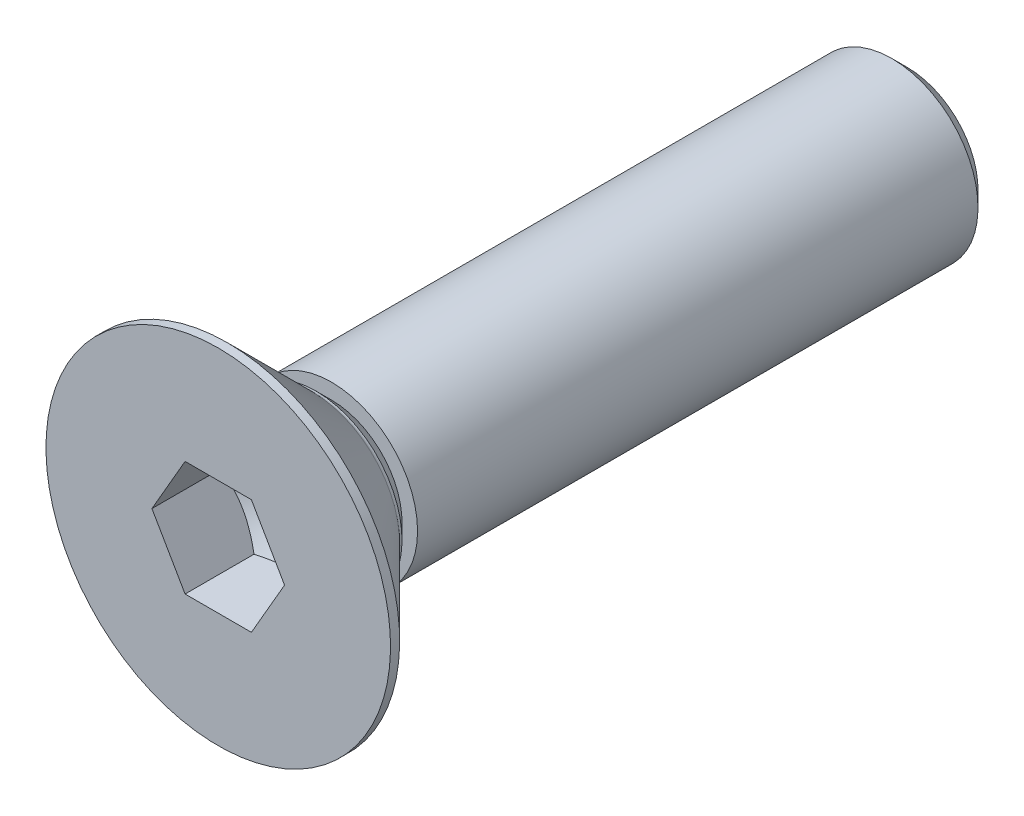
ISO-10303-21;
HEADER;
FILE_DESCRIPTION(('STEP AP214'),'2;1');
FILE_NAME('part.step','',(''),(''),'','','');
FILE_SCHEMA(('AUTOMOTIVE_DESIGN { 1 0 10303 214 1 1 1 1 }'));
ENDSEC;
DATA;
#1=APPLICATION_CONTEXT('core data for automotive mechanical design processes');
#2=APPLICATION_PROTOCOL_DEFINITION('international standard','automotive_design',2000,#1);
#3=PRODUCT_CONTEXT('',#1,'mechanical');
#4=PRODUCT('Part','Part','',(#3));
#5=PRODUCT_RELATED_PRODUCT_CATEGORY('part','',(#4));
#6=PRODUCT_DEFINITION_FORMATION('','',#4);
#7=PRODUCT_DEFINITION_CONTEXT('part definition',#1,'design');
#8=PRODUCT_DEFINITION('design','',#6,#7);
#9=PRODUCT_DEFINITION_SHAPE('','',#8);
#10=(LENGTH_UNIT() NAMED_UNIT(*) SI_UNIT(.MILLI.,.METRE.));
#11=(NAMED_UNIT(*) PLANE_ANGLE_UNIT() SI_UNIT($,.RADIAN.));
#12=(NAMED_UNIT(*) SI_UNIT($,.STERADIAN.) SOLID_ANGLE_UNIT());
#13=UNCERTAINTY_MEASURE_WITH_UNIT(LENGTH_MEASURE(1.E-05),#10,'distance_accuracy_value','');
#14=(GEOMETRIC_REPRESENTATION_CONTEXT(3) GLOBAL_UNCERTAINTY_ASSIGNED_CONTEXT((#13)) GLOBAL_UNIT_ASSIGNED_CONTEXT((#10,
#11,#12)) REPRESENTATION_CONTEXT('',''));
#15=CARTESIAN_POINT('',(0.,0.,0.));
#16=DIRECTION('',(0.,0.,1.));
#17=DIRECTION('',(1.,0.,0.));
#18=AXIS2_PLACEMENT_3D('',#15,#16,#17);
#19=CARTESIAN_POINT('',(0.,0.6146875,-12.));
#20=DIRECTION('',(0.,0.,-1.));
#21=DIRECTION('',(0.,1.,0.));
#22=AXIS2_PLACEMENT_3D('',#19,#20,#21);
#23=PLANE('',#22);
#24=CARTESIAN_POINT('',(0.,0.,-12.));
#25=DIRECTION('',(0.,0.,-1.));
#26=DIRECTION('',(0.,1.,0.));
#27=AXIS2_PLACEMENT_3D('',#24,#25,#26);
#28=CIRCLE('',#27,1.229375);
#29=CARTESIAN_POINT('',(0.,1.229375,-12.));
#30=VERTEX_POINT('',#29);
#31=EDGE_CURVE('E11',#30,#30,#28,.T.);
#32=ORIENTED_EDGE('',*,*,#31,.T.);
#33=EDGE_LOOP('',(#32));
#34=FACE_BOUND('',#33,.T.);
#35=ADVANCED_FACE('F16',(#34),#23,.T.);
#36=CARTESIAN_POINT('',(0.,0.,-11.8646875));
#37=DIRECTION('',(0.,0.,1.));
#38=DIRECTION('',(0.,1.,0.));
#39=AXIS2_PLACEMENT_3D('',#36,#37,#38);
#40=CONICAL_SURFACE('',#39,1.3646875,0.78539816339745);
#41=CARTESIAN_POINT('',(0.,0.,-11.729375));
#42=DIRECTION('',(0.,0.,-1.));
#43=DIRECTION('',(0.,1.,0.));
#44=AXIS2_PLACEMENT_3D('',#41,#42,#43);
#45=CIRCLE('',#44,1.5);
#46=CARTESIAN_POINT('',(0.,1.5,-11.729375));
#47=VERTEX_POINT('',#46);
#48=EDGE_CURVE('E25',#47,#47,#45,.T.);
#49=ORIENTED_EDGE('',*,*,#48,.T.);
#50=EDGE_LOOP('',(#49));
#51=FACE_BOUND('',#50,.T.);
#52=ORIENTED_EDGE('',*,*,#31,.F.);
#53=EDGE_LOOP('',(#52));
#54=FACE_BOUND('',#53,.T.);
#55=ADVANCED_FACE('F188',(#51,#54),#40,.T.);
#56=CARTESIAN_POINT('',(0.,0.,-6.7646875));
#57=DIRECTION('',(0.,0.,1.));
#58=DIRECTION('',(0.,1.,0.));
#59=AXIS2_PLACEMENT_3D('',#56,#57,#58);
#60=CYLINDRICAL_SURFACE('',#59,1.5);
#61=ORIENTED_EDGE('',*,*,#48,.F.);
#62=EDGE_LOOP('',(#61));
#63=FACE_BOUND('',#62,.T.);
#64=CARTESIAN_POINT('',(0.,0.,-1.970625));
#65=DIRECTION('',(0.,0.,-1.));
#66=DIRECTION('',(0.,1.,0.));
#67=AXIS2_PLACEMENT_3D('',#64,#65,#66);
#68=CIRCLE('',#67,1.5);
#69=CARTESIAN_POINT('',(0.,-1.5,-1.970625));
#70=VERTEX_POINT('',#69);
#71=EDGE_CURVE('E154',#70,#70,#68,.T.);
#72=ORIENTED_EDGE('',*,*,#71,.T.);
#73=EDGE_LOOP('',(#72));
#74=FACE_BOUND('',#73,.T.);
#75=ADVANCED_FACE('F179',(#63,#74),#60,.T.);
#76=CARTESIAN_POINT('',(0.,0.,-1.7));
#77=DIRECTION('',(0.,0.,-1.));
#78=DIRECTION('',(-1.,0.,0.));
#79=AXIS2_PLACEMENT_3D('',#76,#77,#78);
#80=TOROIDAL_SURFACE('',#79,1.6,0.1);
#81=CARTESIAN_POINT('',(0.,0.,-1.62928932188134));
#82=DIRECTION('',(0.,0.,-1.));
#83=DIRECTION('',(0.,1.,0.));
#84=AXIS2_PLACEMENT_3D('',#81,#82,#83);
#85=CIRCLE('',#84,1.52928932188135);
#86=CARTESIAN_POINT('',(0.,1.52928932188135,-1.62928932188134));
#87=VERTEX_POINT('',#86);
#88=EDGE_CURVE('E19',#87,#87,#85,.T.);
#89=ORIENTED_EDGE('',*,*,#88,.T.);
#90=EDGE_LOOP('',(#89));
#91=FACE_BOUND('',#90,.T.);
#92=CARTESIAN_POINT('',(0.,0.,-1.7));
#93=DIRECTION('',(0.,0.,-1.));
#94=DIRECTION('',(0.,1.,0.));
#95=AXIS2_PLACEMENT_3D('',#92,#93,#94);
#96=CIRCLE('',#95,1.5);
#97=CARTESIAN_POINT('',(0.,1.5,-1.7));
#98=VERTEX_POINT('',#97);
#99=EDGE_CURVE('E153',#98,#98,#96,.T.);
#100=ORIENTED_EDGE('',*,*,#99,.F.);
#101=EDGE_LOOP('',(#100));
#102=FACE_BOUND('',#101,.T.);
#103=ADVANCED_FACE('F94',(#91,#102),#80,.F.);
#104=CARTESIAN_POINT('',(0.,0.,-0.893933982822018));
#105=DIRECTION('',(0.,0.,1.));
#106=DIRECTION('',(0.,1.,0.));
#107=AXIS2_PLACEMENT_3D('',#104,#105,#106);
#108=CONICAL_SURFACE('',#107,2.26464466094068,0.785398163397448);
#109=CARTESIAN_POINT('',(0.,0.,-0.158578643762691));
#110=DIRECTION('',(0.,0.,-1.));
#111=DIRECTION('',(0.,1.,0.));
#112=AXIS2_PLACEMENT_3D('',#109,#110,#111);
#113=CIRCLE('',#112,3.);
#114=CARTESIAN_POINT('',(0.,3.,-0.15857864376269));
#115=VERTEX_POINT('',#114);
#116=EDGE_CURVE('E97',#115,#115,#113,.T.);
#117=ORIENTED_EDGE('',*,*,#116,.T.);
#118=EDGE_LOOP('',(#117));
#119=FACE_BOUND('',#118,.T.);
#120=ORIENTED_EDGE('',*,*,#88,.F.);
#121=EDGE_LOOP('',(#120));
#122=FACE_BOUND('',#121,.T.);
#123=ADVANCED_FACE('F178',(#119,#122),#108,.T.);
#124=CARTESIAN_POINT('',(0.,0.,-0.0792893218813458));
#125=DIRECTION('',(0.,0.,1.));
#126=DIRECTION('',(0.,1.,0.));
#127=AXIS2_PLACEMENT_3D('',#124,#125,#126);
#128=CYLINDRICAL_SURFACE('',#127,3.);
#129=CARTESIAN_POINT('',(0.,0.,0.));
#130=DIRECTION('',(0.,0.,-1.));
#131=DIRECTION('',(0.,1.,0.));
#132=AXIS2_PLACEMENT_3D('',#129,#130,#131);
#133=CIRCLE('',#132,3.);
#134=CARTESIAN_POINT('',(0.,3.,0.));
#135=VERTEX_POINT('',#134);
#136=EDGE_CURVE('E99',#135,#135,#133,.T.);
#137=ORIENTED_EDGE('',*,*,#136,.T.);
#138=EDGE_LOOP('',(#137));
#139=FACE_BOUND('',#138,.T.);
#140=ORIENTED_EDGE('',*,*,#116,.F.);
#141=EDGE_LOOP('',(#140));
#142=FACE_BOUND('',#141,.T.);
#143=ADVANCED_FACE('F186',(#139,#142),#128,.T.);
#144=CARTESIAN_POINT('',(0.,1.5,0.));
#145=DIRECTION('',(0.,0.,1.));
#146=DIRECTION('',(0.,-1.,0.));
#147=AXIS2_PLACEMENT_3D('',#144,#145,#146);
#148=PLANE('',#147);
#149=ORIENTED_EDGE('',*,*,#136,.F.);
#150=EDGE_LOOP('',(#149));
#151=FACE_BOUND('',#150,.T.);
#152=DIRECTION('',(-0.5,0.866025403784439,0.));
#153=VECTOR('',#152,1.);
#154=CARTESIAN_POINT('',(-1.19078452641916,0.062500233125054,0.));
#155=LINE('',#154,#153);
#156=CARTESIAN_POINT('',(-0.57735,-0.999999533749891,0.));
#157=VERTEX_POINT('',#156);
#158=CARTESIAN_POINT('',(-1.1547,0.,0.));
#159=VERTEX_POINT('',#158);
#160=EDGE_CURVE('E108',#157,#159,#155,.T.);
#161=ORIENTED_EDGE('',*,*,#160,.T.);
#162=DIRECTION('',(0.5,0.866025403784439,0.));
#163=VECTOR('',#162,1.);
#164=CARTESIAN_POINT('',(-0.541265473580836,1.06249976687495,0.));
#165=LINE('',#164,#163);
#166=CARTESIAN_POINT('',(-0.57735,0.999999533749891,0.));
#167=VERTEX_POINT('',#166);
#168=EDGE_CURVE('E104',#159,#167,#165,.T.);
#169=ORIENTED_EDGE('',*,*,#168,.T.);
#170=DIRECTION('',(1.,0.,0.));
#171=VECTOR('',#170,1.);
#172=CARTESIAN_POINT('',(0.,0.999999533749891,0.));
#173=LINE('',#172,#171);
#174=CARTESIAN_POINT('',(0.57735,0.999999533749891,0.));
#175=VERTEX_POINT('',#174);
#176=EDGE_CURVE('E163',#167,#175,#173,.T.);
#177=ORIENTED_EDGE('',*,*,#176,.T.);
#178=DIRECTION('',(0.5,-0.866025403784439,0.));
#179=VECTOR('',#178,1.);
#180=CARTESIAN_POINT('',(0.541265473580836,1.06249976687495,0.));
#181=LINE('',#180,#179);
#182=CARTESIAN_POINT('',(1.1547,0.,0.));
#183=VERTEX_POINT('',#182);
#184=EDGE_CURVE('E158',#175,#183,#181,.T.);
#185=ORIENTED_EDGE('',*,*,#184,.T.);
#186=DIRECTION('',(-0.5,-0.866025403784439,0.));
#187=VECTOR('',#186,1.);
#188=CARTESIAN_POINT('',(1.19078452641916,0.0625002331250542,0.));
#189=LINE('',#188,#187);
#190=CARTESIAN_POINT('',(0.57735,-0.999999533749891,0.));
#191=VERTEX_POINT('',#190);
#192=EDGE_CURVE('E116',#183,#191,#189,.T.);
#193=ORIENTED_EDGE('',*,*,#192,.T.);
#194=DIRECTION('',(-1.,0.,0.));
#195=VECTOR('',#194,1.);
#196=CARTESIAN_POINT('',(0.,-0.999999533749891,0.));
#197=LINE('',#196,#195);
#198=EDGE_CURVE('E75',#191,#157,#197,.T.);
#199=ORIENTED_EDGE('',*,*,#198,.T.);
#200=EDGE_LOOP('',(#161,#169,#177,#185,#193,#199));
#201=FACE_BOUND('',#200,.T.);
#202=ADVANCED_FACE('F208',(#151,#201),#148,.T.);
#203=CARTESIAN_POINT('',(-0.866025,0.499999766874945,1.));
#204=DIRECTION('',(-0.866025403784439,0.5,0.));
#205=DIRECTION('',(0.5,0.866025403784439,0.));
#206=AXIS2_PLACEMENT_3D('',#203,#204,#205);
#207=PLANE('',#206);
#208=ORIENTED_EDGE('',*,*,#168,.F.);
#209=DIRECTION('',(0.,0.,-1.));
#210=VECTOR('',#209,1.);
#211=CARTESIAN_POINT('',(-1.1547,0.,1.));
#212=LINE('',#211,#210);
#213=CARTESIAN_POINT('',(-1.1547,0.,-1.2));
#214=VERTEX_POINT('',#213);
#215=EDGE_CURVE('E111',#159,#214,#212,.T.);
#216=ORIENTED_EDGE('',*,*,#215,.T.);
#217=CARTESIAN_POINT('',(-1.1547,0.,-1.2));
#218=CARTESIAN_POINT('',(-0.866025000000001,0.499999766874945,-1.36666658895832));
#219=CARTESIAN_POINT('',(-0.57735,0.999999533749891,-1.2));
#220=(BOUNDED_CURVE() B_SPLINE_CURVE(2,(#217,#218,#219),.UNSPECIFIED.,.F.,
.F.) B_SPLINE_CURVE_WITH_KNOTS((3,3),(0.,1.16843559329444),
.UNSPECIFIED.) CURVE() GEOMETRIC_REPRESENTATION_ITEM() RATIONAL_B_SPLINE_CURVE((1.,
1.15470053837925,1.)) REPRESENTATION_ITEM(''));
#221=CARTESIAN_POINT('',(-0.57735,0.999999533749891,-1.2));
#222=VERTEX_POINT('',#221);
#223=EDGE_CURVE('E123',#214,#222,#220,.T.);
#224=ORIENTED_EDGE('',*,*,#223,.T.);
#225=DIRECTION('',(0.,0.,-1.));
#226=VECTOR('',#225,1.);
#227=CARTESIAN_POINT('',(-0.57735,0.999999533749891,1.));
#228=LINE('',#227,#226);
#229=EDGE_CURVE('E165',#167,#222,#228,.T.);
#230=ORIENTED_EDGE('',*,*,#229,.F.);
#231=EDGE_LOOP('',(#208,#216,#224,#230));
#232=FACE_BOUND('',#231,.T.);
#233=ADVANCED_FACE('F210',(#232),#207,.F.);
#234=CARTESIAN_POINT('',(0.,0.999999533749891,1.));
#235=DIRECTION('',(0.,1.,0.));
#236=DIRECTION('',(1.,0.,0.));
#237=AXIS2_PLACEMENT_3D('',#234,#235,#236);
#238=PLANE('',#237);
#239=ORIENTED_EDGE('',*,*,#176,.F.);
#240=ORIENTED_EDGE('',*,*,#229,.T.);
#241=CARTESIAN_POINT('',(-0.57735,0.999999533749891,-1.2));
#242=CARTESIAN_POINT('',(0.,0.999999533749893,-1.36666658895832));
#243=CARTESIAN_POINT('',(0.57735,0.999999533749891,-1.2));
#244=(BOUNDED_CURVE() B_SPLINE_CURVE(2,(#241,#242,#243),.UNSPECIFIED.,.F.,
.F.) B_SPLINE_CURVE_WITH_KNOTS((3,3),(0.,1.16843559329444),
.UNSPECIFIED.) CURVE() GEOMETRIC_REPRESENTATION_ITEM() RATIONAL_B_SPLINE_CURVE((1.,
1.15470053837925,1.)) REPRESENTATION_ITEM(''));
#245=CARTESIAN_POINT('',(0.57735,0.999999533749891,-1.2));
#246=VERTEX_POINT('',#245);
#247=EDGE_CURVE('E120',#222,#246,#244,.T.);
#248=ORIENTED_EDGE('',*,*,#247,.T.);
#249=DIRECTION('',(0.,0.,-1.));
#250=VECTOR('',#249,1.);
#251=CARTESIAN_POINT('',(0.57735,0.999999533749891,1.));
#252=LINE('',#251,#250);
#253=EDGE_CURVE('E155',#175,#246,#252,.T.);
#254=ORIENTED_EDGE('',*,*,#253,.F.);
#255=EDGE_LOOP('',(#239,#240,#248,#254));
#256=FACE_BOUND('',#255,.T.);
#257=ADVANCED_FACE('F216',(#256),#238,.F.);
#258=CARTESIAN_POINT('',(-0.866025,-0.499999766874946,1.));
#259=DIRECTION('',(-0.866025403784439,-0.5,0.));
#260=DIRECTION('',(-0.5,0.866025403784439,0.));
#261=AXIS2_PLACEMENT_3D('',#258,#259,#260);
#262=PLANE('',#261);
#263=ORIENTED_EDGE('',*,*,#160,.F.);
#264=DIRECTION('',(0.,0.,-1.));
#265=VECTOR('',#264,1.);
#266=CARTESIAN_POINT('',(-0.57735,-0.999999533749891,1.));
#267=LINE('',#266,#265);
#268=CARTESIAN_POINT('',(-0.57735,-0.999999533749892,-1.2));
#269=VERTEX_POINT('',#268);
#270=EDGE_CURVE('E118',#157,#269,#267,.T.);
#271=ORIENTED_EDGE('',*,*,#270,.T.);
#272=CARTESIAN_POINT('',(-0.57735,-0.999999533749891,-1.2));
#273=CARTESIAN_POINT('',(-0.866025,-0.499999766874945,-1.36666658895832));
#274=CARTESIAN_POINT('',(-1.1547,0.,-1.2));
#275=(BOUNDED_CURVE() B_SPLINE_CURVE(2,(#272,#273,#274),.UNSPECIFIED.,.F.,
.F.) B_SPLINE_CURVE_WITH_KNOTS((3,3),(0.,1.16843559329444),
.UNSPECIFIED.) CURVE() GEOMETRIC_REPRESENTATION_ITEM() RATIONAL_B_SPLINE_CURVE((1.,
1.15470053837925,1.)) REPRESENTATION_ITEM(''));
#276=EDGE_CURVE('E112',#269,#214,#275,.T.);
#277=ORIENTED_EDGE('',*,*,#276,.T.);
#278=ORIENTED_EDGE('',*,*,#215,.F.);
#279=EDGE_LOOP('',(#263,#271,#277,#278));
#280=FACE_BOUND('',#279,.T.);
#281=ADVANCED_FACE('F226',(#280),#262,.F.);
#282=CARTESIAN_POINT('',(0.,0.,-1.53333317791663));
#283=DIRECTION('',(0.,0.,1.));
#284=DIRECTION('',(0.,1.,0.));
#285=AXIS2_PLACEMENT_3D('',#282,#283,#284);
#286=CONICAL_SURFACE('',#285,0.57735,1.0471975511966);
#287=CARTESIAN_POINT('',(0.,0.,-1.86666635583326));
#288=VERTEX_POINT('',#287);
#289=VERTEX_LOOP('',#288);
#290=FACE_BOUND('',#289,.T.);
#291=CARTESIAN_POINT('',(0.57735,0.999999533749891,-1.2));
#292=CARTESIAN_POINT('',(0.866025000000001,0.499999766874945,-1.36666658895832));
#293=CARTESIAN_POINT('',(1.1547,0.,-1.2));
#294=(BOUNDED_CURVE() B_SPLINE_CURVE(2,(#291,#292,#293),.UNSPECIFIED.,.F.,
.F.) B_SPLINE_CURVE_WITH_KNOTS((3,3),(0.,1.16843559329444),
.UNSPECIFIED.) CURVE() GEOMETRIC_REPRESENTATION_ITEM() RATIONAL_B_SPLINE_CURVE((1.,
1.15470053837925,1.)) REPRESENTATION_ITEM(''));
#295=CARTESIAN_POINT('',(1.1547,0.,-1.2));
#296=VERTEX_POINT('',#295);
#297=EDGE_CURVE('E117',#246,#296,#294,.T.);
#298=ORIENTED_EDGE('',*,*,#297,.F.);
#299=ORIENTED_EDGE('',*,*,#247,.F.);
#300=ORIENTED_EDGE('',*,*,#223,.F.);
#301=ORIENTED_EDGE('',*,*,#276,.F.);
#302=CARTESIAN_POINT('',(0.57735,-0.999999533749891,-1.2));
#303=CARTESIAN_POINT('',(0.,-0.999999533749893,-1.36666658895832));
#304=CARTESIAN_POINT('',(-0.57735,-0.999999533749891,-1.2));
#305=(BOUNDED_CURVE() B_SPLINE_CURVE(2,(#302,#303,#304),.UNSPECIFIED.,.F.,
.F.) B_SPLINE_CURVE_WITH_KNOTS((3,3),(0.,1.16843559329444),
.UNSPECIFIED.) CURVE() GEOMETRIC_REPRESENTATION_ITEM() RATIONAL_B_SPLINE_CURVE((1.,
1.15470053837925,1.)) REPRESENTATION_ITEM(''));
#306=CARTESIAN_POINT('',(0.57735,-0.999999533749891,-1.2));
#307=VERTEX_POINT('',#306);
#308=EDGE_CURVE('E67',#307,#269,#305,.T.);
#309=ORIENTED_EDGE('',*,*,#308,.F.);
#310=CARTESIAN_POINT('',(1.1547,0.,-1.2));
#311=CARTESIAN_POINT('',(0.866025000000001,-0.499999766874945,-1.36666658895832));
#312=CARTESIAN_POINT('',(0.57735,-0.999999533749891,-1.2));
#313=(BOUNDED_CURVE() B_SPLINE_CURVE(2,(#310,#311,#312),.UNSPECIFIED.,.F.,
.F.) B_SPLINE_CURVE_WITH_KNOTS((3,3),(0.,1.16843559329444),
.UNSPECIFIED.) CURVE() GEOMETRIC_REPRESENTATION_ITEM() RATIONAL_B_SPLINE_CURVE((1.,
1.15470053837925,1.)) REPRESENTATION_ITEM(''));
#314=EDGE_CURVE('E135',#296,#307,#313,.T.);
#315=ORIENTED_EDGE('',*,*,#314,.F.);
#316=EDGE_LOOP('',(#298,#299,#300,#301,#309,#315));
#317=FACE_BOUND('',#316,.T.);
#318=ADVANCED_FACE('F228',(#290,#317),#286,.F.);
#319=CARTESIAN_POINT('',(0.,-0.999999533749891,1.));
#320=DIRECTION('',(0.,-1.,0.));
#321=DIRECTION('',(-1.,0.,0.));
#322=AXIS2_PLACEMENT_3D('',#319,#320,#321);
#323=PLANE('',#322);
#324=ORIENTED_EDGE('',*,*,#198,.F.);
#325=DIRECTION('',(0.,0.,-1.));
#326=VECTOR('',#325,1.);
#327=CARTESIAN_POINT('',(0.57735,-0.999999533749891,1.));
#328=LINE('',#327,#326);
#329=EDGE_CURVE('E126',#191,#307,#328,.T.);
#330=ORIENTED_EDGE('',*,*,#329,.T.);
#331=ORIENTED_EDGE('',*,*,#308,.T.);
#332=ORIENTED_EDGE('',*,*,#270,.F.);
#333=EDGE_LOOP('',(#324,#330,#331,#332));
#334=FACE_BOUND('',#333,.T.);
#335=ADVANCED_FACE('F206',(#334),#323,.F.);
#336=CARTESIAN_POINT('',(0.866025,-0.499999766874946,1.));
#337=DIRECTION('',(0.866025403784439,-0.5,0.));
#338=DIRECTION('',(-0.5,-0.866025403784439,0.));
#339=AXIS2_PLACEMENT_3D('',#336,#337,#338);
#340=PLANE('',#339);
#341=ORIENTED_EDGE('',*,*,#192,.F.);
#342=DIRECTION('',(0.,0.,-1.));
#343=VECTOR('',#342,1.);
#344=CARTESIAN_POINT('',(1.1547,0.,1.));
#345=LINE('',#344,#343);
#346=EDGE_CURVE('E113',#183,#296,#345,.T.);
#347=ORIENTED_EDGE('',*,*,#346,.T.);
#348=ORIENTED_EDGE('',*,*,#314,.T.);
#349=ORIENTED_EDGE('',*,*,#329,.F.);
#350=EDGE_LOOP('',(#341,#347,#348,#349));
#351=FACE_BOUND('',#350,.T.);
#352=ADVANCED_FACE('F203',(#351),#340,.F.);
#353=CARTESIAN_POINT('',(0.866025,0.499999766874946,1.));
#354=DIRECTION('',(0.866025403784439,0.5,0.));
#355=DIRECTION('',(0.5,-0.866025403784439,0.));
#356=AXIS2_PLACEMENT_3D('',#353,#354,#355);
#357=PLANE('',#356);
#358=ORIENTED_EDGE('',*,*,#184,.F.);
#359=ORIENTED_EDGE('',*,*,#253,.T.);
#360=ORIENTED_EDGE('',*,*,#297,.T.);
#361=ORIENTED_EDGE('',*,*,#346,.F.);
#362=EDGE_LOOP('',(#358,#359,#360,#361));
#363=FACE_BOUND('',#362,.T.);
#364=ADVANCED_FACE('F205',(#363),#357,.F.);
#365=CARTESIAN_POINT('',(0.,0.,-1.8353125));
#366=DIRECTION('',(0.,0.,1.));
#367=DIRECTION('',(0.,1.,0.));
#368=AXIS2_PLACEMENT_3D('',#365,#366,#367);
#369=CONICAL_SURFACE('',#368,1.3646875,0.785398163397448);
#370=CARTESIAN_POINT('',(0.,0.,-1.970625));
#371=DIRECTION('',(0.,0.,-1.));
#372=DIRECTION('',(0.,1.,0.));
#373=AXIS2_PLACEMENT_3D('',#370,#371,#372);
#374=CIRCLE('',#373,1.229375);
#375=CARTESIAN_POINT('',(0.,1.229375,-1.970625));
#376=VERTEX_POINT('',#375);
#377=EDGE_CURVE('E148',#376,#376,#374,.T.);
#378=ORIENTED_EDGE('',*,*,#377,.F.);
#379=EDGE_LOOP('',(#378));
#380=FACE_BOUND('',#379,.T.);
#381=ORIENTED_EDGE('',*,*,#99,.T.);
#382=EDGE_LOOP('',(#381));
#383=FACE_BOUND('',#382,.T.);
#384=ADVANCED_FACE('F176',(#380,#383),#369,.T.);
#385=CARTESIAN_POINT('',(0.,1.8646875,-1.970625));
#386=DIRECTION('',(0.,0.,-1.));
#387=DIRECTION('',(0.,1.,0.));
#388=AXIS2_PLACEMENT_3D('',#385,#386,#387);
#389=PLANE('',#388);
#390=ORIENTED_EDGE('',*,*,#377,.T.);
#391=EDGE_LOOP('',(#390));
#392=FACE_BOUND('',#391,.T.);
#393=ORIENTED_EDGE('',*,*,#71,.F.);
#394=EDGE_LOOP('',(#393));
#395=FACE_BOUND('',#394,.T.);
#396=ADVANCED_FACE('F240',(#392,#395),#389,.F.);
#397=CLOSED_SHELL('',(#35,#55,#75,#103,#123,#143,#202,#233,#257,#281,#318,#335,#352,#364,#384,#396));
#398=MANIFOLD_SOLID_BREP('B1',#397);
#399=ADVANCED_BREP_SHAPE_REPRESENTATION('',(#18,#398),#14);
#400=SHAPE_DEFINITION_REPRESENTATION(#9,#399);
ENDSEC;
END-ISO-10303-21;
